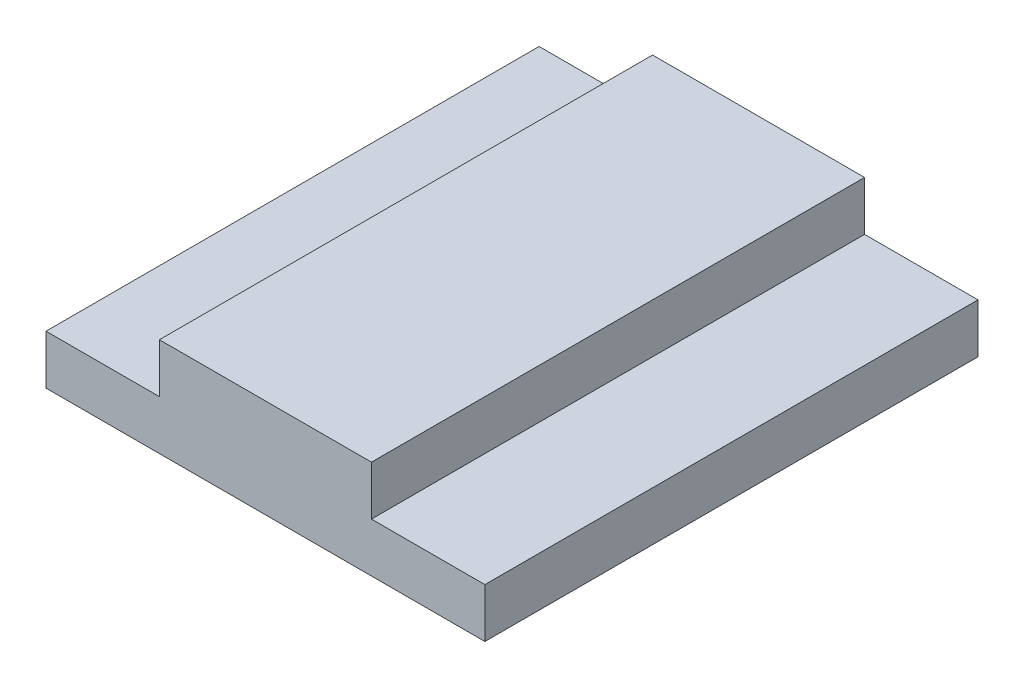
ISO-10303-21;
HEADER;
FILE_DESCRIPTION(('STEP AP214'),'2;1');
FILE_NAME('part.step','',(''),(''),'','','');
FILE_SCHEMA(('AUTOMOTIVE_DESIGN { 1 0 10303 214 1 1 1 1 }'));
ENDSEC;
DATA;
#1=APPLICATION_CONTEXT('core data for automotive mechanical design processes');
#2=APPLICATION_PROTOCOL_DEFINITION('international standard','automotive_design',2000,#1);
#3=PRODUCT_CONTEXT('',#1,'mechanical');
#4=PRODUCT('Part','Part','',(#3));
#5=PRODUCT_RELATED_PRODUCT_CATEGORY('part','',(#4));
#6=PRODUCT_DEFINITION_FORMATION('','',#4);
#7=PRODUCT_DEFINITION_CONTEXT('part definition',#1,'design');
#8=PRODUCT_DEFINITION('design','',#6,#7);
#9=PRODUCT_DEFINITION_SHAPE('','',#8);
#10=(LENGTH_UNIT() NAMED_UNIT(*) SI_UNIT(.MILLI.,.METRE.));
#11=(NAMED_UNIT(*) PLANE_ANGLE_UNIT() SI_UNIT($,.RADIAN.));
#12=(NAMED_UNIT(*) SI_UNIT($,.STERADIAN.) SOLID_ANGLE_UNIT());
#13=UNCERTAINTY_MEASURE_WITH_UNIT(LENGTH_MEASURE(1.E-05),#10,'distance_accuracy_value','');
#14=(GEOMETRIC_REPRESENTATION_CONTEXT(3) GLOBAL_UNCERTAINTY_ASSIGNED_CONTEXT((#13)) GLOBAL_UNIT_ASSIGNED_CONTEXT((#10,
#11,#12)) REPRESENTATION_CONTEXT('',''));
#15=CARTESIAN_POINT('',(0.,0.,0.));
#16=DIRECTION('',(0.,0.,1.));
#17=DIRECTION('',(1.,0.,0.));
#18=AXIS2_PLACEMENT_3D('',#15,#16,#17);
#19=CARTESIAN_POINT('',(0.,10.,0.));
#20=DIRECTION('',(0.,-1.,0.));
#21=DIRECTION('',(0.,0.,-1.));
#22=AXIS2_PLACEMENT_3D('',#19,#20,#21);
#23=PLANE('',#22);
#24=DIRECTION('',(0.,0.,1.));
#25=VECTOR('',#24,1.);
#26=CARTESIAN_POINT('',(-21.5,10.,50.));
#27=LINE('',#26,#25);
#28=CARTESIAN_POINT('',(-21.5,10.,-50.));
#29=VERTEX_POINT('',#28);
#30=CARTESIAN_POINT('',(-21.5,10.,50.));
#31=VERTEX_POINT('',#30);
#32=EDGE_CURVE('E135',#29,#31,#27,.T.);
#33=ORIENTED_EDGE('',*,*,#32,.F.);
#34=DIRECTION('',(-1.,0.,0.));
#35=VECTOR('',#34,1.);
#36=CARTESIAN_POINT('',(-44.5,10.,-50.));
#37=LINE('',#36,#35);
#38=CARTESIAN_POINT('',(-44.5,10.,-50.));
#39=VERTEX_POINT('',#38);
#40=EDGE_CURVE('E125',#29,#39,#37,.T.);
#41=ORIENTED_EDGE('',*,*,#40,.T.);
#42=DIRECTION('',(0.,0.,1.));
#43=VECTOR('',#42,1.);
#44=CARTESIAN_POINT('',(-44.5,10.,50.));
#45=LINE('',#44,#43);
#46=CARTESIAN_POINT('',(-44.5,10.,50.));
#47=VERTEX_POINT('',#46);
#48=EDGE_CURVE('E168',#39,#47,#45,.T.);
#49=ORIENTED_EDGE('',*,*,#48,.T.);
#50=DIRECTION('',(1.,0.,0.));
#51=VECTOR('',#50,1.);
#52=CARTESIAN_POINT('',(-44.5,10.,50.));
#53=LINE('',#52,#51);
#54=EDGE_CURVE('E60',#47,#31,#53,.T.);
#55=ORIENTED_EDGE('',*,*,#54,.T.);
#56=EDGE_LOOP('',(#33,#41,#49,#55));
#57=FACE_BOUND('',#56,.T.);
#58=ADVANCED_FACE('F35',(#57),#23,.F.);
#59=DIRECTION('',(0.,0.,-1.));
#60=VECTOR('',#59,1.);
#61=CARTESIAN_POINT('',(21.5,10.,-50.));
#62=LINE('',#61,#60);
#63=CARTESIAN_POINT('',(21.5,10.,50.));
#64=VERTEX_POINT('',#63);
#65=CARTESIAN_POINT('',(21.5,10.,-50.));
#66=VERTEX_POINT('',#65);
#67=EDGE_CURVE('E52',#64,#66,#62,.T.);
#68=ORIENTED_EDGE('',*,*,#67,.F.);
#69=CARTESIAN_POINT('',(44.5,10.,50.));
#70=VERTEX_POINT('',#69);
#71=EDGE_CURVE('E151',#64,#70,#53,.T.);
#72=ORIENTED_EDGE('',*,*,#71,.T.);
#73=DIRECTION('',(0.,0.,-1.));
#74=VECTOR('',#73,1.);
#75=CARTESIAN_POINT('',(44.5,10.,50.));
#76=LINE('',#75,#74);
#77=CARTESIAN_POINT('',(44.5,10.,-50.));
#78=VERTEX_POINT('',#77);
#79=EDGE_CURVE('E146',#70,#78,#76,.T.);
#80=ORIENTED_EDGE('',*,*,#79,.T.);
#81=EDGE_CURVE('E169',#78,#66,#37,.T.);
#82=ORIENTED_EDGE('',*,*,#81,.T.);
#83=EDGE_LOOP('',(#68,#72,#80,#82));
#84=FACE_BOUND('',#83,.T.);
#85=ADVANCED_FACE('F198',(#84),#23,.F.);
#86=CARTESIAN_POINT('',(44.5,10.,50.));
#87=DIRECTION('',(-1.,0.,0.));
#88=DIRECTION('',(0.,0.,1.));
#89=AXIS2_PLACEMENT_3D('',#86,#87,#88);
#90=PLANE('',#89);
#91=DIRECTION('',(0.,0.,-1.));
#92=VECTOR('',#91,1.);
#93=CARTESIAN_POINT('',(44.5,0.,50.));
#94=LINE('',#93,#92);
#95=CARTESIAN_POINT('',(44.5,0.,50.));
#96=VERTEX_POINT('',#95);
#97=CARTESIAN_POINT('',(44.5,0.,-50.));
#98=VERTEX_POINT('',#97);
#99=EDGE_CURVE('E126',#96,#98,#94,.T.);
#100=ORIENTED_EDGE('',*,*,#99,.T.);
#101=DIRECTION('',(0.,-1.,0.));
#102=VECTOR('',#101,1.);
#103=CARTESIAN_POINT('',(44.5,10.,-50.));
#104=LINE('',#103,#102);
#105=EDGE_CURVE('E11',#78,#98,#104,.T.);
#106=ORIENTED_EDGE('',*,*,#105,.F.);
#107=ORIENTED_EDGE('',*,*,#79,.F.);
#108=DIRECTION('',(0.,-1.,0.));
#109=VECTOR('',#108,1.);
#110=CARTESIAN_POINT('',(44.5,10.,50.));
#111=LINE('',#110,#109);
#112=EDGE_CURVE('E165',#70,#96,#111,.T.);
#113=ORIENTED_EDGE('',*,*,#112,.T.);
#114=EDGE_LOOP('',(#100,#106,#107,#113));
#115=FACE_BOUND('',#114,.T.);
#116=ADVANCED_FACE('F37',(#115),#90,.F.);
#117=CARTESIAN_POINT('',(-44.5,10.,-50.));
#118=DIRECTION('',(0.,0.,1.));
#119=DIRECTION('',(1.,0.,0.));
#120=AXIS2_PLACEMENT_3D('',#117,#118,#119);
#121=PLANE('',#120);
#122=DIRECTION('',(-1.,0.,0.));
#123=VECTOR('',#122,1.);
#124=CARTESIAN_POINT('',(-44.5,0.,-50.));
#125=LINE('',#124,#123);
#126=CARTESIAN_POINT('',(-44.5,0.,-50.));
#127=VERTEX_POINT('',#126);
#128=EDGE_CURVE('E128',#98,#127,#125,.T.);
#129=ORIENTED_EDGE('',*,*,#128,.T.);
#130=DIRECTION('',(0.,-1.,0.));
#131=VECTOR('',#130,1.);
#132=CARTESIAN_POINT('',(-44.5,10.,-50.));
#133=LINE('',#132,#131);
#134=EDGE_CURVE('E44',#39,#127,#133,.T.);
#135=ORIENTED_EDGE('',*,*,#134,.F.);
#136=ORIENTED_EDGE('',*,*,#40,.F.);
#137=DIRECTION('',(0.,-1.,0.));
#138=VECTOR('',#137,1.);
#139=CARTESIAN_POINT('',(-21.5,20.,-50.));
#140=LINE('',#139,#138);
#141=CARTESIAN_POINT('',(-21.5,20.,-50.));
#142=VERTEX_POINT('',#141);
#143=EDGE_CURVE('E106',#142,#29,#140,.T.);
#144=ORIENTED_EDGE('',*,*,#143,.F.);
#145=DIRECTION('',(-1.,0.,0.));
#146=VECTOR('',#145,1.);
#147=CARTESIAN_POINT('',(-21.5,20.,-50.));
#148=LINE('',#147,#146);
#149=CARTESIAN_POINT('',(21.5,20.,-50.));
#150=VERTEX_POINT('',#149);
#151=EDGE_CURVE('E112',#150,#142,#148,.T.);
#152=ORIENTED_EDGE('',*,*,#151,.F.);
#153=DIRECTION('',(0.,-1.,0.));
#154=VECTOR('',#153,1.);
#155=CARTESIAN_POINT('',(21.5,20.,-50.));
#156=LINE('',#155,#154);
#157=EDGE_CURVE('E154',#150,#66,#156,.T.);
#158=ORIENTED_EDGE('',*,*,#157,.T.);
#159=ORIENTED_EDGE('',*,*,#81,.F.);
#160=ORIENTED_EDGE('',*,*,#105,.T.);
#161=EDGE_LOOP('',(#129,#135,#136,#144,#152,#158,#159,#160));
#162=FACE_BOUND('',#161,.T.);
#163=ADVANCED_FACE('F123',(#162),#121,.F.);
#164=CARTESIAN_POINT('',(-44.5,10.,50.));
#165=DIRECTION('',(1.,0.,0.));
#166=DIRECTION('',(0.,0.,-1.));
#167=AXIS2_PLACEMENT_3D('',#164,#165,#166);
#168=PLANE('',#167);
#169=DIRECTION('',(0.,0.,1.));
#170=VECTOR('',#169,1.);
#171=CARTESIAN_POINT('',(-44.5,0.,50.));
#172=LINE('',#171,#170);
#173=CARTESIAN_POINT('',(-44.5,0.,50.));
#174=VERTEX_POINT('',#173);
#175=EDGE_CURVE('E188',#127,#174,#172,.T.);
#176=ORIENTED_EDGE('',*,*,#175,.T.);
#177=DIRECTION('',(0.,-1.,0.));
#178=VECTOR('',#177,1.);
#179=CARTESIAN_POINT('',(-44.5,10.,50.));
#180=LINE('',#179,#178);
#181=EDGE_CURVE('E182',#47,#174,#180,.T.);
#182=ORIENTED_EDGE('',*,*,#181,.F.);
#183=ORIENTED_EDGE('',*,*,#48,.F.);
#184=ORIENTED_EDGE('',*,*,#134,.T.);
#185=EDGE_LOOP('',(#176,#182,#183,#184));
#186=FACE_BOUND('',#185,.T.);
#187=ADVANCED_FACE('F194',(#186),#168,.F.);
#188=CARTESIAN_POINT('',(-44.5,10.,50.));
#189=DIRECTION('',(0.,0.,-1.));
#190=DIRECTION('',(-1.,0.,0.));
#191=AXIS2_PLACEMENT_3D('',#188,#189,#190);
#192=PLANE('',#191);
#193=DIRECTION('',(1.,0.,0.));
#194=VECTOR('',#193,1.);
#195=CARTESIAN_POINT('',(-44.5,0.,50.));
#196=LINE('',#195,#194);
#197=EDGE_CURVE('E186',#174,#96,#196,.T.);
#198=ORIENTED_EDGE('',*,*,#197,.T.);
#199=ORIENTED_EDGE('',*,*,#112,.F.);
#200=ORIENTED_EDGE('',*,*,#71,.F.);
#201=DIRECTION('',(0.,-1.,0.));
#202=VECTOR('',#201,1.);
#203=CARTESIAN_POINT('',(21.5,20.,50.));
#204=LINE('',#203,#202);
#205=CARTESIAN_POINT('',(21.5,20.,50.));
#206=VERTEX_POINT('',#205);
#207=EDGE_CURVE('E130',#206,#64,#204,.T.);
#208=ORIENTED_EDGE('',*,*,#207,.F.);
#209=DIRECTION('',(1.,0.,0.));
#210=VECTOR('',#209,1.);
#211=CARTESIAN_POINT('',(21.5,20.,50.));
#212=LINE('',#211,#210);
#213=CARTESIAN_POINT('',(-21.5,20.,50.));
#214=VERTEX_POINT('',#213);
#215=EDGE_CURVE('E111',#214,#206,#212,.T.);
#216=ORIENTED_EDGE('',*,*,#215,.F.);
#217=DIRECTION('',(0.,-1.,0.));
#218=VECTOR('',#217,1.);
#219=CARTESIAN_POINT('',(-21.5,20.,50.));
#220=LINE('',#219,#218);
#221=EDGE_CURVE('E108',#214,#31,#220,.T.);
#222=ORIENTED_EDGE('',*,*,#221,.T.);
#223=ORIENTED_EDGE('',*,*,#54,.F.);
#224=ORIENTED_EDGE('',*,*,#181,.T.);
#225=EDGE_LOOP('',(#198,#199,#200,#208,#216,#222,#223,#224));
#226=FACE_BOUND('',#225,.T.);
#227=ADVANCED_FACE('F162',(#226),#192,.F.);
#228=CARTESIAN_POINT('',(0.,0.,0.));
#229=DIRECTION('',(0.,-1.,0.));
#230=DIRECTION('',(0.,0.,-1.));
#231=AXIS2_PLACEMENT_3D('',#228,#229,#230);
#232=PLANE('',#231);
#233=ORIENTED_EDGE('',*,*,#99,.F.);
#234=ORIENTED_EDGE('',*,*,#197,.F.);
#235=ORIENTED_EDGE('',*,*,#175,.F.);
#236=ORIENTED_EDGE('',*,*,#128,.F.);
#237=EDGE_LOOP('',(#233,#234,#235,#236));
#238=FACE_BOUND('',#237,.T.);
#239=ADVANCED_FACE('F196',(#238),#232,.T.);
#240=CARTESIAN_POINT('',(-21.5,20.,50.));
#241=DIRECTION('',(1.,0.,0.));
#242=DIRECTION('',(0.,0.,-1.));
#243=AXIS2_PLACEMENT_3D('',#240,#241,#242);
#244=PLANE('',#243);
#245=ORIENTED_EDGE('',*,*,#32,.T.);
#246=ORIENTED_EDGE('',*,*,#221,.F.);
#247=DIRECTION('',(0.,0.,1.));
#248=VECTOR('',#247,1.);
#249=CARTESIAN_POINT('',(-21.5,20.,50.));
#250=LINE('',#249,#248);
#251=EDGE_CURVE('E102',#142,#214,#250,.T.);
#252=ORIENTED_EDGE('',*,*,#251,.F.);
#253=ORIENTED_EDGE('',*,*,#143,.T.);
#254=EDGE_LOOP('',(#245,#246,#252,#253));
#255=FACE_BOUND('',#254,.T.);
#256=ADVANCED_FACE('F104',(#255),#244,.F.);
#257=CARTESIAN_POINT('',(21.5,20.,-50.));
#258=DIRECTION('',(-1.,0.,0.));
#259=DIRECTION('',(0.,0.,1.));
#260=AXIS2_PLACEMENT_3D('',#257,#258,#259);
#261=PLANE('',#260);
#262=ORIENTED_EDGE('',*,*,#67,.T.);
#263=ORIENTED_EDGE('',*,*,#157,.F.);
#264=DIRECTION('',(0.,0.,-1.));
#265=VECTOR('',#264,1.);
#266=CARTESIAN_POINT('',(21.5,20.,-50.));
#267=LINE('',#266,#265);
#268=EDGE_CURVE('E117',#206,#150,#267,.T.);
#269=ORIENTED_EDGE('',*,*,#268,.F.);
#270=ORIENTED_EDGE('',*,*,#207,.T.);
#271=EDGE_LOOP('',(#262,#263,#269,#270));
#272=FACE_BOUND('',#271,.T.);
#273=ADVANCED_FACE('F160',(#272),#261,.F.);
#274=CARTESIAN_POINT('',(0.,20.,0.));
#275=DIRECTION('',(0.,-1.,0.));
#276=DIRECTION('',(0.,0.,-1.));
#277=AXIS2_PLACEMENT_3D('',#274,#275,#276);
#278=PLANE('',#277);
#279=ORIENTED_EDGE('',*,*,#151,.T.);
#280=ORIENTED_EDGE('',*,*,#251,.T.);
#281=ORIENTED_EDGE('',*,*,#215,.T.);
#282=ORIENTED_EDGE('',*,*,#268,.T.);
#283=EDGE_LOOP('',(#279,#280,#281,#282));
#284=FACE_BOUND('',#283,.T.);
#285=ADVANCED_FACE('F115',(#284),#278,.F.);
#286=CLOSED_SHELL('',(#58,#85,#116,#163,#187,#227,#239,#256,#273,#285));
#287=MANIFOLD_SOLID_BREP('B2',#286);
#288=ADVANCED_BREP_SHAPE_REPRESENTATION('',(#18,#287),#14);
#289=SHAPE_DEFINITION_REPRESENTATION(#9,#288);
ENDSEC;
END-ISO-10303-21;
